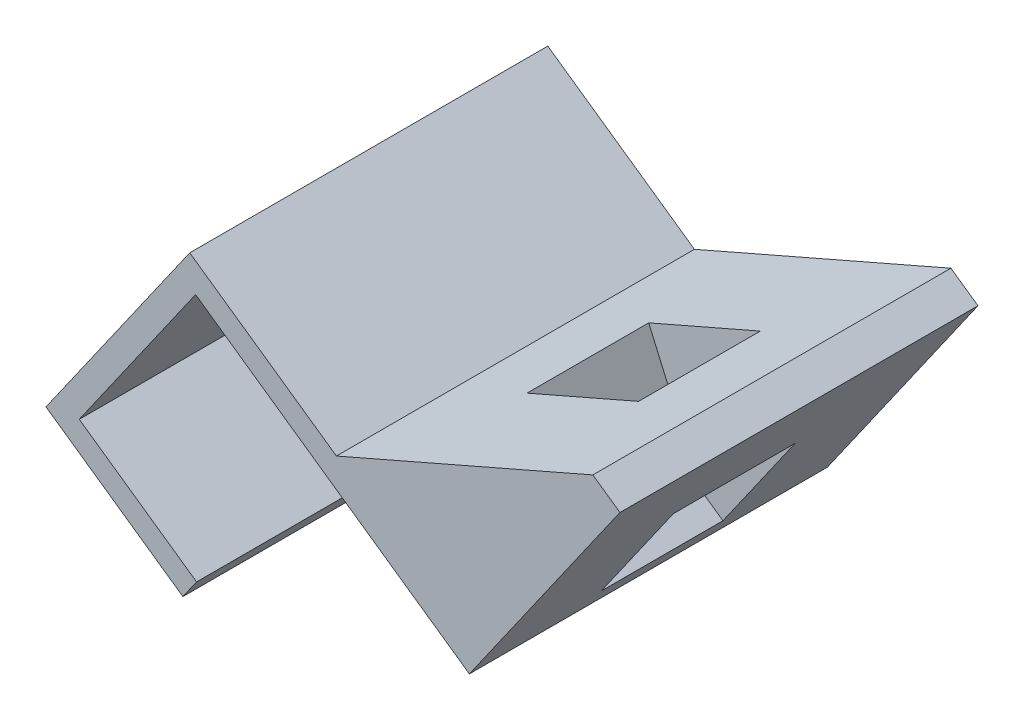
ISO-10303-21;
HEADER;
FILE_DESCRIPTION(('STEP AP214'),'2;1');
FILE_NAME('part.step','',(''),(''),'','','');
FILE_SCHEMA(('AUTOMOTIVE_DESIGN { 1 0 10303 214 1 1 1 1 }'));
ENDSEC;
DATA;
#1=APPLICATION_CONTEXT('core data for automotive mechanical design processes');
#2=APPLICATION_PROTOCOL_DEFINITION('international standard','automotive_design',2000,#1);
#3=PRODUCT_CONTEXT('',#1,'mechanical');
#4=PRODUCT('Part','Part','',(#3));
#5=PRODUCT_RELATED_PRODUCT_CATEGORY('part','',(#4));
#6=PRODUCT_DEFINITION_FORMATION('','',#4);
#7=PRODUCT_DEFINITION_CONTEXT('part definition',#1,'design');
#8=PRODUCT_DEFINITION('design','',#6,#7);
#9=PRODUCT_DEFINITION_SHAPE('','',#8);
#10=(LENGTH_UNIT() NAMED_UNIT(*) SI_UNIT(.MILLI.,.METRE.));
#11=(NAMED_UNIT(*) PLANE_ANGLE_UNIT() SI_UNIT($,.RADIAN.));
#12=(NAMED_UNIT(*) SI_UNIT($,.STERADIAN.) SOLID_ANGLE_UNIT());
#13=UNCERTAINTY_MEASURE_WITH_UNIT(LENGTH_MEASURE(1.E-05),#10,'distance_accuracy_value','');
#14=(GEOMETRIC_REPRESENTATION_CONTEXT(3) GLOBAL_UNCERTAINTY_ASSIGNED_CONTEXT((#13)) GLOBAL_UNIT_ASSIGNED_CONTEXT((#10,
#11,#12)) REPRESENTATION_CONTEXT('',''));
#15=CARTESIAN_POINT('',(0.,0.,0.));
#16=DIRECTION('',(0.,0.,1.));
#17=DIRECTION('',(1.,0.,0.));
#18=AXIS2_PLACEMENT_3D('',#15,#16,#17);
#19=CARTESIAN_POINT('',(-55.7902692212998,21.8489153202428,19.05));
#20=DIRECTION('',(0.573462344363328,0.819231920519041,0.));
#21=DIRECTION('',(-0.819231920519041,0.573462344363328,0.));
#22=AXIS2_PLACEMENT_3D('',#19,#20,#21);
#23=PLANE('',#22);
#24=DIRECTION('',(0.81923192051904,-0.573462344363328,0.));
#25=VECTOR('',#24,1.);
#26=CARTESIAN_POINT('',(-55.7902692212998,21.8489153202428,19.05));
#27=LINE('',#26,#25);
#28=CARTESIAN_POINT('',(-55.7902692212998,21.8489153202428,19.05));
#29=VERTEX_POINT('',#28);
#30=CARTESIAN_POINT('',(-40.183901135412,10.9244576601214,19.05));
#31=VERTEX_POINT('',#30);
#32=EDGE_CURVE('E192',#29,#31,#27,.T.);
#33=ORIENTED_EDGE('',*,*,#32,.T.);
#34=DIRECTION('',(0.,0.,-1.));
#35=VECTOR('',#34,1.);
#36=CARTESIAN_POINT('',(-40.1839011354121,10.9244576601213,19.05));
#37=LINE('',#36,#35);
#38=CARTESIAN_POINT('',(-40.1839011354121,10.9244576601214,-19.05));
#39=VERTEX_POINT('',#38);
#40=EDGE_CURVE('E239',#31,#39,#37,.T.);
#41=ORIENTED_EDGE('',*,*,#40,.T.);
#42=DIRECTION('',(0.81923192051904,-0.573462344363328,0.));
#43=VECTOR('',#42,1.);
#44=CARTESIAN_POINT('',(-55.7902692212998,21.8489153202428,-19.05));
#45=LINE('',#44,#43);
#46=CARTESIAN_POINT('',(-55.7902692212998,21.8489153202428,-19.05));
#47=VERTEX_POINT('',#46);
#48=EDGE_CURVE('E213',#47,#39,#45,.T.);
#49=ORIENTED_EDGE('',*,*,#48,.F.);
#50=DIRECTION('',(0.,0.,-1.));
#51=VECTOR('',#50,1.);
#52=CARTESIAN_POINT('',(-55.7902692212998,21.8489153202428,19.05));
#53=LINE('',#52,#51);
#54=EDGE_CURVE('E232',#29,#47,#53,.T.);
#55=ORIENTED_EDGE('',*,*,#54,.F.);
#56=EDGE_LOOP('',(#33,#41,#49,#55));
#57=FACE_BOUND('',#56,.T.);
#58=ADVANCED_FACE('F41',(#57),#23,.T.);
#59=CARTESIAN_POINT('',(-57.2468635759826,19.7680662421244,19.05));
#60=DIRECTION('',(0.573462344363328,0.819231920519041,0.));
#61=DIRECTION('',(-0.819231920519041,0.573462344363328,0.));
#62=AXIS2_PLACEMENT_3D('',#59,#60,#61);
#63=PLANE('',#62);
#64=DIRECTION('',(0.819231920519041,-0.573462344363328,0.));
#65=VECTOR('',#64,1.);
#66=CARTESIAN_POINT('',(-57.2468635759826,19.7680662421244,-19.05));
#67=LINE('',#66,#65);
#68=CARTESIAN_POINT('',(-55.1660144978642,18.3114718874416,-19.05));
#69=VERTEX_POINT('',#68);
#70=CARTESIAN_POINT('',(-26.0341274042071,-2.08084907811837,-19.05));
#71=VERTEX_POINT('',#70);
#72=EDGE_CURVE('E182',#69,#71,#67,.T.);
#73=ORIENTED_EDGE('',*,*,#72,.T.);
#74=DIRECTION('',(0.,0.,-1.));
#75=VECTOR('',#74,1.);
#76=CARTESIAN_POINT('',(-26.0341274042071,-2.08084907811837,19.05));
#77=LINE('',#76,#75);
#78=CARTESIAN_POINT('',(-26.0341274042071,-2.08084907811837,19.05));
#79=VERTEX_POINT('',#78);
#80=EDGE_CURVE('E240',#79,#71,#77,.T.);
#81=ORIENTED_EDGE('',*,*,#80,.F.);
#82=DIRECTION('',(0.819231920519041,-0.573462344363328,0.));
#83=VECTOR('',#82,1.);
#84=CARTESIAN_POINT('',(-57.2468635759826,19.7680662421244,19.05));
#85=LINE('',#84,#83);
#86=CARTESIAN_POINT('',(-55.1660144978642,18.3114718874416,19.05));
#87=VERTEX_POINT('',#86);
#88=EDGE_CURVE('E184',#87,#79,#85,.T.);
#89=ORIENTED_EDGE('',*,*,#88,.F.);
#90=DIRECTION('',(0.,0.,-1.));
#91=VECTOR('',#90,1.);
#92=CARTESIAN_POINT('',(-55.1660144978642,18.3114718874416,19.05));
#93=LINE('',#92,#91);
#94=EDGE_CURVE('E210',#87,#69,#93,.T.);
#95=ORIENTED_EDGE('',*,*,#94,.T.);
#96=EDGE_LOOP('',(#73,#81,#89,#95));
#97=FACE_BOUND('',#96,.T.);
#98=ADVANCED_FACE('F43',(#97),#63,.F.);
#99=CARTESIAN_POINT('',(-24.5775330495243,0.,19.05));
#100=DIRECTION('',(0.819231920519044,-0.573462344363324,0.));
#101=DIRECTION('',(0.573462344363324,0.819231920519044,0.));
#102=AXIS2_PLACEMENT_3D('',#99,#100,#101);
#103=PLANE('',#102);
#104=DIRECTION('',(0.573462344363324,0.819231920519044,0.));
#105=VECTOR('',#104,1.);
#106=CARTESIAN_POINT('',(-24.5775330495243,0.,-6.477));
#107=LINE('',#106,#105);
#108=CARTESIAN_POINT('',(-24.5775330495243,0.,-6.477));
#109=VERTEX_POINT('',#108);
#110=CARTESIAN_POINT('',(-16.8977907433531,10.9710604373876,-6.477));
#111=VERTEX_POINT('',#110);
#112=EDGE_CURVE('E175',#109,#111,#107,.T.);
#113=ORIENTED_EDGE('',*,*,#112,.F.);
#114=DIRECTION('',(0.,0.,1.));
#115=VECTOR('',#114,1.);
#116=CARTESIAN_POINT('',(-24.5775330495243,0.,19.05));
#117=LINE('',#116,#115);
#118=CARTESIAN_POINT('',(-24.5775330495243,0.,6.477));
#119=VERTEX_POINT('',#118);
#120=EDGE_CURVE('E12',#109,#119,#117,.T.);
#121=ORIENTED_EDGE('',*,*,#120,.T.);
#122=DIRECTION('',(-0.573462344363324,-0.819231920519044,0.));
#123=VECTOR('',#122,1.);
#124=CARTESIAN_POINT('',(-24.5775330495243,0.,6.477));
#125=LINE('',#124,#123);
#126=CARTESIAN_POINT('',(-16.8977907433531,10.9710604373876,6.477));
#127=VERTEX_POINT('',#126);
#128=EDGE_CURVE('E149',#127,#119,#125,.T.);
#129=ORIENTED_EDGE('',*,*,#128,.F.);
#130=DIRECTION('',(0.,0.,1.));
#131=VECTOR('',#130,1.);
#132=CARTESIAN_POINT('',(-16.8977907433531,10.9710604373876,19.05));
#133=LINE('',#132,#131);
#134=EDGE_CURVE('E167',#111,#127,#133,.T.);
#135=ORIENTED_EDGE('',*,*,#134,.F.);
#136=EDGE_LOOP('',(#113,#121,#129,#135));
#137=FACE_BOUND('',#136,.T.);
#138=DIRECTION('',(-0.573462344363324,-0.819231920519044,0.));
#139=VECTOR('',#138,1.);
#140=CARTESIAN_POINT('',(-24.5775330495243,0.,-19.05));
#141=LINE('',#140,#139);
#142=CARTESIAN_POINT('',(-10.0115895026959,20.8084907811837,-19.05));
#143=VERTEX_POINT('',#142);
#144=EDGE_CURVE('E208',#143,#71,#141,.T.);
#145=ORIENTED_EDGE('',*,*,#144,.F.);
#146=DIRECTION('',(0.,0.,1.));
#147=VECTOR('',#146,1.);
#148=CARTESIAN_POINT('',(-10.0115895026959,20.8084907811837,19.05));
#149=LINE('',#148,#147);
#150=CARTESIAN_POINT('',(-10.0115895026959,20.8084907811837,19.05));
#151=VERTEX_POINT('',#150);
#152=EDGE_CURVE('E179',#143,#151,#149,.T.);
#153=ORIENTED_EDGE('',*,*,#152,.T.);
#154=DIRECTION('',(-0.573462344363324,-0.819231920519044,0.));
#155=VECTOR('',#154,1.);
#156=CARTESIAN_POINT('',(-24.5775330495243,0.,19.05));
#157=LINE('',#156,#155);
#158=EDGE_CURVE('E190',#151,#79,#157,.T.);
#159=ORIENTED_EDGE('',*,*,#158,.T.);
#160=ORIENTED_EDGE('',*,*,#80,.T.);
#161=EDGE_LOOP('',(#145,#153,#159,#160));
#162=FACE_BOUND('',#161,.T.);
#163=ADVANCED_FACE('F270',(#137,#162),#103,.T.);
#164=CARTESIAN_POINT('',(-71.0845099454697,0.,19.05));
#165=DIRECTION('',(-0.81923192051904,0.573462344363328,0.));
#166=DIRECTION('',(-0.573462344363328,-0.81923192051904,0.));
#167=AXIS2_PLACEMENT_3D('',#164,#165,#166);
#168=PLANE('',#167);
#169=DIRECTION('',(0.573462344363328,0.81923192051904,0.));
#170=VECTOR('',#169,1.);
#171=CARTESIAN_POINT('',(-71.0845099454697,0.,-19.05));
#172=LINE('',#171,#170);
#173=CARTESIAN_POINT('',(-71.0845099454697,0.,-19.05));
#174=VERTEX_POINT('',#173);
#175=EDGE_CURVE('E212',#174,#47,#172,.T.);
#176=ORIENTED_EDGE('',*,*,#175,.F.);
#177=DIRECTION('',(0.,0.,-1.));
#178=VECTOR('',#177,1.);
#179=CARTESIAN_POINT('',(-71.0845099454697,0.,19.05));
#180=LINE('',#179,#178);
#181=CARTESIAN_POINT('',(-71.0845099454697,0.,19.05));
#182=VERTEX_POINT('',#181);
#183=EDGE_CURVE('E231',#182,#174,#180,.T.);
#184=ORIENTED_EDGE('',*,*,#183,.F.);
#185=DIRECTION('',(0.573462344363328,0.81923192051904,0.));
#186=VECTOR('',#185,1.);
#187=CARTESIAN_POINT('',(-71.0845099454697,0.,19.05));
#188=LINE('',#187,#186);
#189=EDGE_CURVE('E191',#182,#29,#188,.T.);
#190=ORIENTED_EDGE('',*,*,#189,.T.);
#191=ORIENTED_EDGE('',*,*,#54,.T.);
#192=EDGE_LOOP('',(#176,#184,#190,#191));
#193=FACE_BOUND('',#192,.T.);
#194=ADVANCED_FACE('F291',(#193),#168,.T.);
#195=CARTESIAN_POINT('',(-71.0845099454697,0.,19.05));
#196=DIRECTION('',(-0.573462344363328,-0.819231920519041,0.));
#197=DIRECTION('',(0.819231920519041,-0.573462344363328,0.));
#198=AXIS2_PLACEMENT_3D('',#195,#196,#197);
#199=PLANE('',#198);
#200=DIRECTION('',(-0.819231920519041,0.573462344363328,0.));
#201=VECTOR('',#200,1.);
#202=CARTESIAN_POINT('',(-71.0845099454697,0.,-19.05));
#203=LINE('',#202,#201);
#204=CARTESIAN_POINT('',(-56.5185663986412,-10.19616048278,-19.05));
#205=VERTEX_POINT('',#204);
#206=EDGE_CURVE('E211',#205,#174,#203,.T.);
#207=ORIENTED_EDGE('',*,*,#206,.F.);
#208=DIRECTION('',(0.,0.,-1.));
#209=VECTOR('',#208,1.);
#210=CARTESIAN_POINT('',(-56.5185663986412,-10.19616048278,19.05));
#211=LINE('',#210,#209);
#212=CARTESIAN_POINT('',(-56.5185663986412,-10.19616048278,19.05));
#213=VERTEX_POINT('',#212);
#214=EDGE_CURVE('E233',#213,#205,#211,.T.);
#215=ORIENTED_EDGE('',*,*,#214,.F.);
#216=DIRECTION('',(-0.819231920519041,0.573462344363328,0.));
#217=VECTOR('',#216,1.);
#218=CARTESIAN_POINT('',(-71.0845099454697,0.,19.05));
#219=LINE('',#218,#217);
#220=EDGE_CURVE('E200',#213,#182,#219,.T.);
#221=ORIENTED_EDGE('',*,*,#220,.T.);
#222=ORIENTED_EDGE('',*,*,#183,.T.);
#223=EDGE_LOOP('',(#207,#215,#221,#222));
#224=FACE_BOUND('',#223,.T.);
#225=ADVANCED_FACE('F301',(#224),#199,.T.);
#226=CARTESIAN_POINT('',(-55.0619720439583,-8.1153114046616,19.05));
#227=DIRECTION('',(0.81923192051904,-0.573462344363329,0.));
#228=DIRECTION('',(0.573462344363329,0.81923192051904,0.));
#229=AXIS2_PLACEMENT_3D('',#226,#227,#228);
#230=PLANE('',#229);
#231=DIRECTION('',(-0.573462344363329,-0.81923192051904,0.));
#232=VECTOR('',#231,1.);
#233=CARTESIAN_POINT('',(-55.0619720439583,-8.1153114046616,-19.05));
#234=LINE('',#233,#232);
#235=CARTESIAN_POINT('',(-55.0619720439583,-8.1153114046616,-19.05));
#236=VERTEX_POINT('',#235);
#237=EDGE_CURVE('E217',#236,#205,#234,.T.);
#238=ORIENTED_EDGE('',*,*,#237,.F.);
#239=DIRECTION('',(0.,0.,-1.));
#240=VECTOR('',#239,1.);
#241=CARTESIAN_POINT('',(-55.0619720439583,-8.1153114046616,19.05));
#242=LINE('',#241,#240);
#243=CARTESIAN_POINT('',(-55.0619720439583,-8.1153114046616,19.05));
#244=VERTEX_POINT('',#243);
#245=EDGE_CURVE('E230',#244,#236,#242,.T.);
#246=ORIENTED_EDGE('',*,*,#245,.F.);
#247=DIRECTION('',(-0.573462344363329,-0.81923192051904,0.));
#248=VECTOR('',#247,1.);
#249=CARTESIAN_POINT('',(-55.0619720439583,-8.1153114046616,19.05));
#250=LINE('',#249,#248);
#251=EDGE_CURVE('E199',#244,#213,#250,.T.);
#252=ORIENTED_EDGE('',*,*,#251,.T.);
#253=ORIENTED_EDGE('',*,*,#214,.T.);
#254=EDGE_LOOP('',(#238,#246,#252,#253));
#255=FACE_BOUND('',#254,.T.);
#256=ADVANCED_FACE('F306',(#255),#230,.T.);
#257=CARTESIAN_POINT('',(-69.6279155907869,2.08084907811836,19.05));
#258=DIRECTION('',(-0.573462344363328,-0.819231920519041,0.));
#259=DIRECTION('',(0.819231920519041,-0.573462344363328,0.));
#260=AXIS2_PLACEMENT_3D('',#257,#258,#259);
#261=PLANE('',#260);
#262=DIRECTION('',(-0.819231920519041,0.573462344363328,0.));
#263=VECTOR('',#262,1.);
#264=CARTESIAN_POINT('',(-69.6279155907869,2.08084907811836,-19.05));
#265=LINE('',#264,#263);
#266=CARTESIAN_POINT('',(-67.5470665126685,0.624254723435511,-19.05));
#267=VERTEX_POINT('',#266);
#268=EDGE_CURVE('E222',#236,#267,#265,.T.);
#269=ORIENTED_EDGE('',*,*,#268,.T.);
#270=DIRECTION('',(0.,0.,-1.));
#271=VECTOR('',#270,1.);
#272=CARTESIAN_POINT('',(-67.5470665126685,0.624254723435511,19.05));
#273=LINE('',#272,#271);
#274=CARTESIAN_POINT('',(-67.5470665126685,0.624254723435511,19.05));
#275=VERTEX_POINT('',#274);
#276=EDGE_CURVE('E228',#275,#267,#273,.T.);
#277=ORIENTED_EDGE('',*,*,#276,.F.);
#278=DIRECTION('',(-0.819231920519041,0.573462344363328,0.));
#279=VECTOR('',#278,1.);
#280=CARTESIAN_POINT('',(-69.6279155907869,2.08084907811836,19.05));
#281=LINE('',#280,#279);
#282=EDGE_CURVE('E204',#244,#275,#281,.T.);
#283=ORIENTED_EDGE('',*,*,#282,.F.);
#284=ORIENTED_EDGE('',*,*,#245,.T.);
#285=EDGE_LOOP('',(#269,#277,#283,#284));
#286=FACE_BOUND('',#285,.T.);
#287=ADVANCED_FACE('F330',(#286),#261,.F.);
#288=CARTESIAN_POINT('',(-69.0036608673514,-1.45659435468285,19.05));
#289=DIRECTION('',(-0.81923192051904,0.573462344363328,0.));
#290=DIRECTION('',(-0.573462344363329,-0.81923192051904,0.));
#291=AXIS2_PLACEMENT_3D('',#288,#289,#290);
#292=PLANE('',#291);
#293=DIRECTION('',(0.573462344363329,0.81923192051904,0.));
#294=VECTOR('',#293,1.);
#295=CARTESIAN_POINT('',(-69.0036608673514,-1.45659435468285,-19.05));
#296=LINE('',#295,#294);
#297=EDGE_CURVE('E189',#267,#69,#296,.T.);
#298=ORIENTED_EDGE('',*,*,#297,.T.);
#299=ORIENTED_EDGE('',*,*,#94,.F.);
#300=DIRECTION('',(0.573462344363329,0.81923192051904,0.));
#301=VECTOR('',#300,1.);
#302=CARTESIAN_POINT('',(-69.0036608673514,-1.45659435468285,19.05));
#303=LINE('',#302,#301);
#304=EDGE_CURVE('E203',#275,#87,#303,.T.);
#305=ORIENTED_EDGE('',*,*,#304,.F.);
#306=ORIENTED_EDGE('',*,*,#276,.T.);
#307=EDGE_LOOP('',(#298,#299,#305,#306));
#308=FACE_BOUND('',#307,.T.);
#309=ADVANCED_FACE('F331',(#308),#292,.F.);
#310=CARTESIAN_POINT('',(0.,0.,19.05));
#311=DIRECTION('',(0.,0.,-1.));
#312=DIRECTION('',(-1.,0.,0.));
#313=AXIS2_PLACEMENT_3D('',#310,#311,#312);
#314=PLANE('',#313);
#315=DIRECTION('',(0.819231920519044,-0.573462344363324,0.));
#316=VECTOR('',#315,1.);
#317=CARTESIAN_POINT('',(-25.6179575885837,31.732948441305,19.05));
#318=LINE('',#317,#316);
#319=CARTESIAN_POINT('',(-12.8958067649413,22.8274428647555,19.05));
#320=VERTEX_POINT('',#319);
#321=EDGE_CURVE('E181',#320,#151,#318,.T.);
#322=ORIENTED_EDGE('',*,*,#321,.F.);
#323=DIRECTION('',(-0.916595354064308,-0.399816153885414,0.));
#324=VECTOR('',#323,1.);
#325=CARTESIAN_POINT('',(-40.183901135412,10.9244576601214,19.05));
#326=LINE('',#325,#324);
#327=EDGE_CURVE('E174',#320,#31,#326,.T.);
#328=ORIENTED_EDGE('',*,*,#327,.T.);
#329=ORIENTED_EDGE('',*,*,#32,.F.);
#330=ORIENTED_EDGE('',*,*,#189,.F.);
#331=ORIENTED_EDGE('',*,*,#220,.F.);
#332=ORIENTED_EDGE('',*,*,#251,.F.);
#333=ORIENTED_EDGE('',*,*,#282,.T.);
#334=ORIENTED_EDGE('',*,*,#304,.T.);
#335=ORIENTED_EDGE('',*,*,#88,.T.);
#336=ORIENTED_EDGE('',*,*,#158,.F.);
#337=EDGE_LOOP('',(#322,#328,#329,#330,#331,#332,#333,#334,#335,#336));
#338=FACE_BOUND('',#337,.T.);
#339=ADVANCED_FACE('F322',(#338),#314,.F.);
#340=CARTESIAN_POINT('',(0.,0.,-19.05));
#341=DIRECTION('',(0.,0.,-1.));
#342=DIRECTION('',(-1.,0.,0.));
#343=AXIS2_PLACEMENT_3D('',#340,#341,#342);
#344=PLANE('',#343);
#345=DIRECTION('',(-0.916595354064309,-0.399816153885414,0.));
#346=VECTOR('',#345,1.);
#347=CARTESIAN_POINT('',(-10.4269973637478,23.9043301466783,-19.05));
#348=LINE('',#347,#346);
#349=CARTESIAN_POINT('',(-12.8958067649413,22.8274428647555,-19.05));
#350=VERTEX_POINT('',#349);
#351=EDGE_CURVE('E172',#350,#39,#348,.T.);
#352=ORIENTED_EDGE('',*,*,#351,.F.);
#353=DIRECTION('',(0.819231920519044,-0.573462344363324,0.));
#354=VECTOR('',#353,1.);
#355=CARTESIAN_POINT('',(-25.6179575885837,31.732948441305,-19.05));
#356=LINE('',#355,#354);
#357=EDGE_CURVE('E183',#350,#143,#356,.T.);
#358=ORIENTED_EDGE('',*,*,#357,.T.);
#359=ORIENTED_EDGE('',*,*,#144,.T.);
#360=ORIENTED_EDGE('',*,*,#72,.F.);
#361=ORIENTED_EDGE('',*,*,#297,.F.);
#362=ORIENTED_EDGE('',*,*,#268,.F.);
#363=ORIENTED_EDGE('',*,*,#237,.T.);
#364=ORIENTED_EDGE('',*,*,#206,.T.);
#365=ORIENTED_EDGE('',*,*,#175,.T.);
#366=ORIENTED_EDGE('',*,*,#48,.T.);
#367=EDGE_LOOP('',(#352,#358,#359,#360,#361,#362,#363,#364,#365,#366));
#368=FACE_BOUND('',#367,.T.);
#369=ADVANCED_FACE('F313',(#368),#344,.T.);
#370=CARTESIAN_POINT('',(-25.6179575885837,31.732948441305,19.05));
#371=DIRECTION('',(0.573462344363324,0.819231920519044,0.));
#372=DIRECTION('',(-0.819231920519044,0.573462344363324,0.));
#373=AXIS2_PLACEMENT_3D('',#370,#371,#372);
#374=PLANE('',#373);
#375=DIRECTION('',(0.,0.,-1.));
#376=VECTOR('',#375,1.);
#377=CARTESIAN_POINT('',(-12.8958067649413,22.8274428647555,19.05));
#378=LINE('',#377,#376);
#379=EDGE_CURVE('E178',#320,#350,#378,.T.);
#380=ORIENTED_EDGE('',*,*,#379,.F.);
#381=ORIENTED_EDGE('',*,*,#321,.T.);
#382=ORIENTED_EDGE('',*,*,#152,.F.);
#383=ORIENTED_EDGE('',*,*,#357,.F.);
#384=EDGE_LOOP('',(#380,#381,#382,#383));
#385=FACE_BOUND('',#384,.T.);
#386=ADVANCED_FACE('F342',(#385),#374,.T.);
#387=CARTESIAN_POINT('',(-40.183901135412,10.9244576601214,19.05));
#388=DIRECTION('',(0.399816153885414,-0.916595354064308,0.));
#389=DIRECTION('',(0.916595354064309,0.399816153885414,0.));
#390=AXIS2_PLACEMENT_3D('',#387,#388,#389);
#391=PLANE('',#390);
#392=DIRECTION('',(-0.916595354064308,-0.399816153885414,0.));
#393=VECTOR('',#392,1.);
#394=CARTESIAN_POINT('',(-40.183901135412,10.9244576601214,6.477));
#395=LINE('',#394,#393);
#396=CARTESIAN_POINT('',(-20.6030658419022,19.4655594911543,6.477));
#397=VERTEX_POINT('',#396);
#398=CARTESIAN_POINT('',(-32.4766420584512,14.2863410337226,6.477));
#399=VERTEX_POINT('',#398);
#400=EDGE_CURVE('E237',#397,#399,#395,.T.);
#401=ORIENTED_EDGE('',*,*,#400,.T.);
#402=DIRECTION('',(0.,0.,-1.));
#403=VECTOR('',#402,1.);
#404=CARTESIAN_POINT('',(-32.4766420584512,14.2863410337226,19.05));
#405=LINE('',#404,#403);
#406=CARTESIAN_POINT('',(-32.4766420584512,14.2863410337226,-6.477));
#407=VERTEX_POINT('',#406);
#408=EDGE_CURVE('E47',#399,#407,#405,.T.);
#409=ORIENTED_EDGE('',*,*,#408,.T.);
#410=DIRECTION('',(0.916595354064308,0.399816153885414,0.));
#411=VECTOR('',#410,1.);
#412=CARTESIAN_POINT('',(-40.183901135412,10.9244576601214,-6.477));
#413=LINE('',#412,#411);
#414=CARTESIAN_POINT('',(-20.6030658419022,19.4655594911543,-6.477));
#415=VERTEX_POINT('',#414);
#416=EDGE_CURVE('E253',#407,#415,#413,.T.);
#417=ORIENTED_EDGE('',*,*,#416,.T.);
#418=DIRECTION('',(0.,0.,1.));
#419=VECTOR('',#418,1.);
#420=CARTESIAN_POINT('',(-20.6030658419022,19.4655594911543,19.05));
#421=LINE('',#420,#419);
#422=EDGE_CURVE('E255',#415,#397,#421,.T.);
#423=ORIENTED_EDGE('',*,*,#422,.T.);
#424=EDGE_LOOP('',(#401,#409,#417,#423));
#425=FACE_BOUND('',#424,.T.);
#426=ORIENTED_EDGE('',*,*,#40,.F.);
#427=ORIENTED_EDGE('',*,*,#327,.F.);
#428=ORIENTED_EDGE('',*,*,#379,.T.);
#429=ORIENTED_EDGE('',*,*,#351,.T.);
#430=EDGE_LOOP('',(#426,#427,#428,#429));
#431=FACE_BOUND('',#430,.T.);
#432=ADVANCED_FACE('F259',(#425,#431),#391,.F.);
#433=CARTESIAN_POINT('',(-11.0436483666568,-34.849698745247,6.477));
#434=DIRECTION('',(-0.916595354064308,-0.399816153885414,0.));
#435=DIRECTION('',(0.399816153885414,-0.916595354064309,0.));
#436=AXIS2_PLACEMENT_3D('',#433,#434,#435);
#437=PLANE('',#436);
#438=DIRECTION('',(-0.399816153885414,0.916595354064308,0.));
#439=VECTOR('',#438,1.);
#440=CARTESIAN_POINT('',(-11.0436483666568,-34.849698745247,6.477));
#441=LINE('',#440,#439);
#442=CARTESIAN_POINT('',(-26.9779083807311,1.68026273184478,6.477));
#443=VERTEX_POINT('',#442);
#444=EDGE_CURVE('E64',#443,#399,#441,.T.);
#445=ORIENTED_EDGE('',*,*,#444,.F.);
#446=DIRECTION('',(0.,0.,-1.));
#447=VECTOR('',#446,1.);
#448=CARTESIAN_POINT('',(-26.9779083807311,1.68026273184478,6.477));
#449=LINE('',#448,#447);
#450=CARTESIAN_POINT('',(-26.9779083807311,1.68026273184478,-6.477));
#451=VERTEX_POINT('',#450);
#452=EDGE_CURVE('E146',#443,#451,#449,.T.);
#453=ORIENTED_EDGE('',*,*,#452,.T.);
#454=DIRECTION('',(-0.399816153885414,0.916595354064308,0.));
#455=VECTOR('',#454,1.);
#456=CARTESIAN_POINT('',(-11.0436483666568,-34.849698745247,-6.477));
#457=LINE('',#456,#455);
#458=EDGE_CURVE('E272',#451,#407,#457,.T.);
#459=ORIENTED_EDGE('',*,*,#458,.T.);
#460=ORIENTED_EDGE('',*,*,#408,.F.);
#461=EDGE_LOOP('',(#445,#453,#459,#460));
#462=FACE_BOUND('',#461,.T.);
#463=ADVANCED_FACE('F156',(#462),#437,.F.);
#464=CARTESIAN_POINT('',(0.82992784989221,-29.6704802878154,-6.477));
#465=DIRECTION('',(0.,0.,-1.));
#466=DIRECTION('',(-1.,0.,0.));
#467=AXIS2_PLACEMENT_3D('',#464,#465,#466);
#468=PLANE('',#467);
#469=ORIENTED_EDGE('',*,*,#112,.T.);
#470=DIRECTION('',(-0.399816153885414,0.916595354064308,0.));
#471=VECTOR('',#470,1.);
#472=CARTESIAN_POINT('',(0.82992784989221,-29.6704802878154,-6.477));
#473=LINE('',#472,#471);
#474=EDGE_CURVE('E164',#111,#415,#473,.T.);
#475=ORIENTED_EDGE('',*,*,#474,.T.);
#476=ORIENTED_EDGE('',*,*,#416,.F.);
#477=ORIENTED_EDGE('',*,*,#458,.F.);
#478=DIRECTION('',(0.819231920519041,-0.573462344363328,0.));
#479=VECTOR('',#478,1.);
#480=CARTESIAN_POINT('',(6.41360594435977,-21.6937972957188,-6.477));
#481=LINE('',#480,#479);
#482=EDGE_CURVE('E153',#451,#109,#481,.T.);
#483=ORIENTED_EDGE('',*,*,#482,.T.);
#484=EDGE_LOOP('',(#469,#475,#476,#477,#483));
#485=FACE_BOUND('',#484,.T.);
#486=ADVANCED_FACE('F268',(#485),#468,.F.);
#487=CARTESIAN_POINT('',(0.82992784989221,-29.6704802878154,6.477));
#488=DIRECTION('',(0.916595354064308,0.399816153885414,0.));
#489=DIRECTION('',(-0.399816153885414,0.916595354064309,0.));
#490=AXIS2_PLACEMENT_3D('',#487,#488,#489);
#491=PLANE('',#490);
#492=ORIENTED_EDGE('',*,*,#134,.T.);
#493=DIRECTION('',(-0.399816153885414,0.916595354064308,0.));
#494=VECTOR('',#493,1.);
#495=CARTESIAN_POINT('',(0.82992784989221,-29.6704802878154,6.477));
#496=LINE('',#495,#494);
#497=EDGE_CURVE('E162',#127,#397,#496,.T.);
#498=ORIENTED_EDGE('',*,*,#497,.T.);
#499=ORIENTED_EDGE('',*,*,#422,.F.);
#500=ORIENTED_EDGE('',*,*,#474,.F.);
#501=EDGE_LOOP('',(#492,#498,#499,#500));
#502=FACE_BOUND('',#501,.T.);
#503=ADVANCED_FACE('F261',(#502),#491,.F.);
#504=CARTESIAN_POINT('',(0.82992784989221,-29.6704802878154,6.477));
#505=DIRECTION('',(0.,0.,1.));
#506=DIRECTION('',(1.,0.,0.));
#507=AXIS2_PLACEMENT_3D('',#504,#505,#506);
#508=PLANE('',#507);
#509=ORIENTED_EDGE('',*,*,#128,.T.);
#510=DIRECTION('',(-0.819231920519041,0.573462344363328,0.));
#511=VECTOR('',#510,1.);
#512=CARTESIAN_POINT('',(6.41360594435977,-21.6937972957188,6.477));
#513=LINE('',#512,#511);
#514=EDGE_CURVE('E57',#119,#443,#513,.T.);
#515=ORIENTED_EDGE('',*,*,#514,.T.);
#516=ORIENTED_EDGE('',*,*,#444,.T.);
#517=ORIENTED_EDGE('',*,*,#400,.F.);
#518=ORIENTED_EDGE('',*,*,#497,.F.);
#519=EDGE_LOOP('',(#509,#515,#516,#517,#518));
#520=FACE_BOUND('',#519,.T.);
#521=ADVANCED_FACE('F143',(#520),#508,.F.);
#522=CARTESIAN_POINT('',(-55.7902692212998,21.8489153202428,19.05));
#523=DIRECTION('',(0.573462344363328,0.819231920519041,0.));
#524=DIRECTION('',(-0.819231920519041,0.573462344363328,0.));
#525=AXIS2_PLACEMENT_3D('',#522,#523,#524);
#526=PLANE('',#525);
#527=ORIENTED_EDGE('',*,*,#482,.F.);
#528=ORIENTED_EDGE('',*,*,#452,.F.);
#529=ORIENTED_EDGE('',*,*,#514,.F.);
#530=ORIENTED_EDGE('',*,*,#120,.F.);
#531=EDGE_LOOP('',(#527,#528,#529,#530));
#532=FACE_BOUND('',#531,.T.);
#533=ADVANCED_FACE('F155',(#532),#526,.T.);
#534=CLOSED_SHELL('',(#58,#98,#163,#194,#225,#256,#287,#309,#339,#369,#386,#432,#463,#486,#503,
#521,#533));
#535=MANIFOLD_SOLID_BREP('B2',#534);
#536=ADVANCED_BREP_SHAPE_REPRESENTATION('',(#18,#535),#14);
#537=SHAPE_DEFINITION_REPRESENTATION(#9,#536);
ENDSEC;
END-ISO-10303-21;
